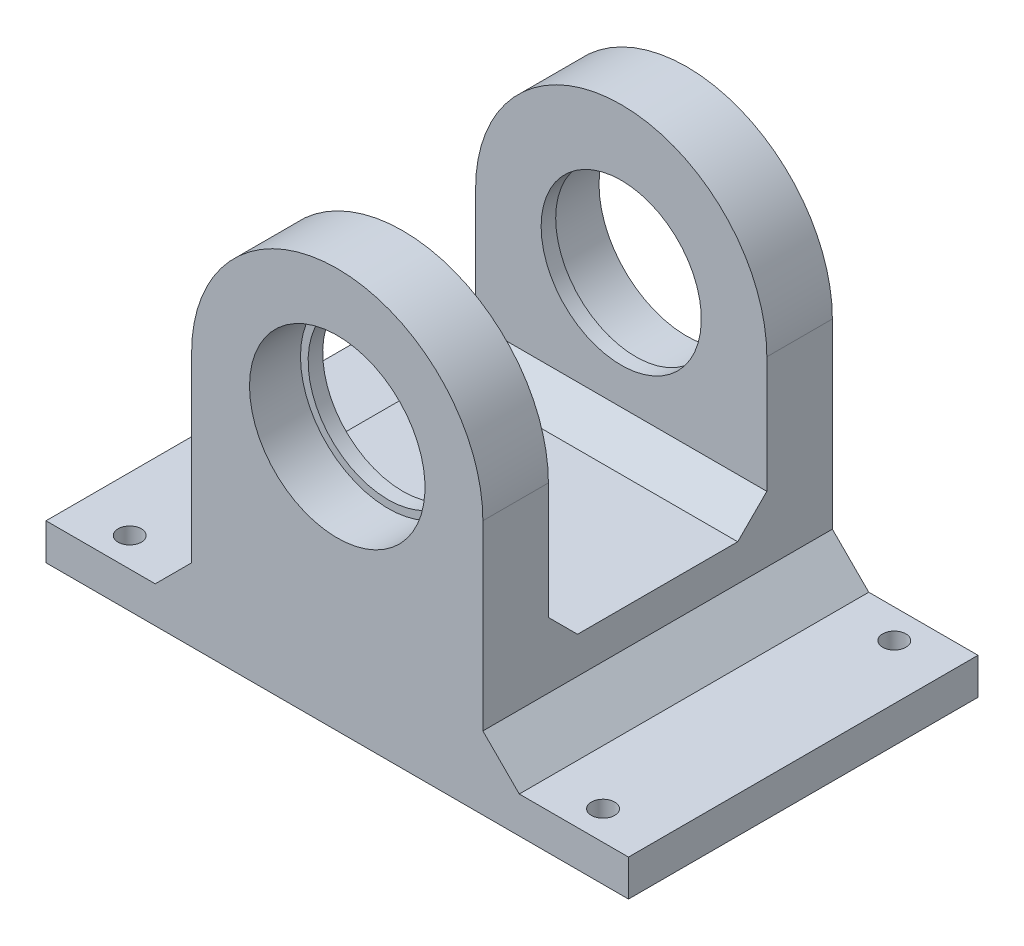
ISO-10303-21;
HEADER;
FILE_DESCRIPTION(('STEP AP214'),'2;1');
FILE_NAME('part.step','',(''),(''),'','','');
FILE_SCHEMA(('AUTOMOTIVE_DESIGN { 1 0 10303 214 1 1 1 1 }'));
ENDSEC;
DATA;
#1=APPLICATION_CONTEXT('core data for automotive mechanical design processes');
#2=APPLICATION_PROTOCOL_DEFINITION('international standard','automotive_design',2000,#1);
#3=PRODUCT_CONTEXT('',#1,'mechanical');
#4=PRODUCT('Part','Part','',(#3));
#5=PRODUCT_RELATED_PRODUCT_CATEGORY('part','',(#4));
#6=PRODUCT_DEFINITION_FORMATION('','',#4);
#7=PRODUCT_DEFINITION_CONTEXT('part definition',#1,'design');
#8=PRODUCT_DEFINITION('design','',#6,#7);
#9=PRODUCT_DEFINITION_SHAPE('','',#8);
#10=(LENGTH_UNIT() NAMED_UNIT(*) SI_UNIT(.MILLI.,.METRE.));
#11=(NAMED_UNIT(*) PLANE_ANGLE_UNIT() SI_UNIT($,.RADIAN.));
#12=(NAMED_UNIT(*) SI_UNIT($,.STERADIAN.) SOLID_ANGLE_UNIT());
#13=UNCERTAINTY_MEASURE_WITH_UNIT(LENGTH_MEASURE(1.E-05),#10,'distance_accuracy_value','');
#14=(GEOMETRIC_REPRESENTATION_CONTEXT(3) GLOBAL_UNCERTAINTY_ASSIGNED_CONTEXT((#13)) GLOBAL_UNIT_ASSIGNED_CONTEXT((#10,
#11,#12)) REPRESENTATION_CONTEXT('',''));
#15=CARTESIAN_POINT('',(0.,0.,0.));
#16=DIRECTION('',(0.,0.,1.));
#17=DIRECTION('',(1.,0.,0.));
#18=AXIS2_PLACEMENT_3D('',#15,#16,#17);
#19=CARTESIAN_POINT('',(-20.,-35.,24.));
#20=DIRECTION('',(1.,0.,0.));
#21=DIRECTION('',(0.,0.,-1.));
#22=AXIS2_PLACEMENT_3D('',#19,#20,#21);
#23=PLANE('',#22);
#24=DIRECTION('',(0.,-1.,0.));
#25=VECTOR('',#24,1.);
#26=CARTESIAN_POINT('',(-20.,-35.,-24.));
#27=LINE('',#26,#25);
#28=CARTESIAN_POINT('',(-20.,0.,-24.));
#29=VERTEX_POINT('',#28);
#30=CARTESIAN_POINT('',(-20.,-25.,-24.));
#31=VERTEX_POINT('',#30);
#32=EDGE_CURVE('E297',#29,#31,#27,.T.);
#33=ORIENTED_EDGE('',*,*,#32,.T.);
#34=DIRECTION('',(0.,0.,1.));
#35=VECTOR('',#34,1.);
#36=CARTESIAN_POINT('',(-20.,-25.,24.));
#37=LINE('',#36,#35);
#38=CARTESIAN_POINT('',(-20.,-25.,24.));
#39=VERTEX_POINT('',#38);
#40=EDGE_CURVE('E105',#31,#39,#37,.T.);
#41=ORIENTED_EDGE('',*,*,#40,.T.);
#42=DIRECTION('',(0.,-1.,0.));
#43=VECTOR('',#42,1.);
#44=CARTESIAN_POINT('',(-20.,-35.,24.));
#45=LINE('',#44,#43);
#46=CARTESIAN_POINT('',(-20.,0.,24.));
#47=VERTEX_POINT('',#46);
#48=EDGE_CURVE('E211',#47,#39,#45,.T.);
#49=ORIENTED_EDGE('',*,*,#48,.F.);
#50=DIRECTION('',(0.,0.,-1.));
#51=VECTOR('',#50,1.);
#52=CARTESIAN_POINT('',(-20.,0.,24.));
#53=LINE('',#52,#51);
#54=CARTESIAN_POINT('',(-20.,0.,15.));
#55=VERTEX_POINT('',#54);
#56=EDGE_CURVE('E300',#47,#55,#53,.T.);
#57=ORIENTED_EDGE('',*,*,#56,.T.);
#58=DIRECTION('',(0.,-1.,0.));
#59=VECTOR('',#58,1.);
#60=CARTESIAN_POINT('',(-20.,49.949963180842,15.));
#61=LINE('',#60,#59);
#62=CARTESIAN_POINT('',(-20.,-16.,15.));
#63=VERTEX_POINT('',#62);
#64=EDGE_CURVE('E273',#55,#63,#61,.T.);
#65=ORIENTED_EDGE('',*,*,#64,.T.);
#66=DIRECTION('',(0.,0.707106781186545,0.70710678118655));
#67=VECTOR('',#66,1.);
#68=CARTESIAN_POINT('',(-20.,-20.9999999999999,10.));
#69=LINE('',#68,#67);
#70=CARTESIAN_POINT('',(-20.,-20.,11.));
#71=VERTEX_POINT('',#70);
#72=EDGE_CURVE('E329',#63,#71,#69,.F.);
#73=ORIENTED_EDGE('',*,*,#72,.T.);
#74=DIRECTION('',(0.,0.,-1.));
#75=VECTOR('',#74,1.);
#76=CARTESIAN_POINT('',(-20.,-20.,15.));
#77=LINE('',#76,#75);
#78=CARTESIAN_POINT('',(-20.,-20.,-11.));
#79=VERTEX_POINT('',#78);
#80=EDGE_CURVE('E276',#71,#79,#77,.T.);
#81=ORIENTED_EDGE('',*,*,#80,.T.);
#82=DIRECTION('',(0.,-0.707106781186551,0.707106781186544));
#83=VECTOR('',#82,1.);
#84=CARTESIAN_POINT('',(-20.,-45.0000000000001,13.9999999999998));
#85=LINE('',#84,#83);
#86=CARTESIAN_POINT('',(-20.,-15.9999999999999,-15.));
#87=VERTEX_POINT('',#86);
#88=EDGE_CURVE('E325',#79,#87,#85,.F.);
#89=ORIENTED_EDGE('',*,*,#88,.T.);
#90=DIRECTION('',(0.,1.,0.));
#91=VECTOR('',#90,1.);
#92=CARTESIAN_POINT('',(-20.,49.949963180842,-15.));
#93=LINE('',#92,#91);
#94=CARTESIAN_POINT('',(-20.,0.,-15.));
#95=VERTEX_POINT('',#94);
#96=EDGE_CURVE('E271',#87,#95,#93,.T.);
#97=ORIENTED_EDGE('',*,*,#96,.T.);
#98=EDGE_CURVE('E210',#95,#29,#53,.T.);
#99=ORIENTED_EDGE('',*,*,#98,.T.);
#100=EDGE_LOOP('',(#33,#41,#49,#57,#65,#73,#81,#89,#97,#99));
#101=FACE_BOUND('',#100,.T.);
#102=ADVANCED_FACE('F82',(#101),#23,.F.);
#103=CARTESIAN_POINT('',(0.,0.,24.));
#104=DIRECTION('',(0.,0.,-1.));
#105=DIRECTION('',(-1.,0.,0.));
#106=AXIS2_PLACEMENT_3D('',#103,#104,#105);
#107=CYLINDRICAL_SURFACE('',#106,11.);
#108=CARTESIAN_POINT('',(0.,0.,15.));
#109=DIRECTION('',(0.,0.,1.));
#110=DIRECTION('',(0.,-1.,0.));
#111=AXIS2_PLACEMENT_3D('',#108,#109,#110);
#112=CIRCLE('',#111,11.);
#113=CARTESIAN_POINT('',(0.,-11.,15.));
#114=VERTEX_POINT('',#113);
#115=EDGE_CURVE('E279',#114,#114,#112,.T.);
#116=ORIENTED_EDGE('',*,*,#115,.F.);
#117=EDGE_LOOP('',(#116));
#118=FACE_BOUND('',#117,.T.);
#119=CARTESIAN_POINT('',(0.,0.,17.));
#120=DIRECTION('',(0.,0.,1.));
#121=DIRECTION('',(1.,0.,0.));
#122=AXIS2_PLACEMENT_3D('',#119,#120,#121);
#123=CIRCLE('',#122,11.);
#124=CARTESIAN_POINT('',(11.,0.,17.));
#125=VERTEX_POINT('',#124);
#126=EDGE_CURVE('E253',#125,#125,#123,.T.);
#127=ORIENTED_EDGE('',*,*,#126,.T.);
#128=EDGE_LOOP('',(#127));
#129=FACE_BOUND('',#128,.T.);
#130=ADVANCED_FACE('F401',(#118,#129),#107,.F.);
#131=CARTESIAN_POINT('',(0.,0.,-15.));
#132=DIRECTION('',(0.,0.,-1.));
#133=DIRECTION('',(0.,1.,0.));
#134=AXIS2_PLACEMENT_3D('',#131,#132,#133);
#135=CIRCLE('',#134,11.);
#136=CARTESIAN_POINT('',(0.,11.,-15.));
#137=VERTEX_POINT('',#136);
#138=EDGE_CURVE('E283',#137,#137,#135,.T.);
#139=ORIENTED_EDGE('',*,*,#138,.F.);
#140=EDGE_LOOP('',(#139));
#141=FACE_BOUND('',#140,.T.);
#142=CARTESIAN_POINT('',(0.,0.,-17.));
#143=DIRECTION('',(0.,0.,-1.));
#144=DIRECTION('',(-1.,0.,0.));
#145=AXIS2_PLACEMENT_3D('',#142,#143,#144);
#146=CIRCLE('',#145,11.);
#147=CARTESIAN_POINT('',(-11.,0.,-17.));
#148=VERTEX_POINT('',#147);
#149=EDGE_CURVE('E259',#148,#148,#146,.T.);
#150=ORIENTED_EDGE('',*,*,#149,.T.);
#151=EDGE_LOOP('',(#150));
#152=FACE_BOUND('',#151,.T.);
#153=ADVANCED_FACE('F406',(#141,#152),#107,.F.);
#154=CARTESIAN_POINT('',(0.,0.,24.));
#155=DIRECTION('',(0.,0.,-1.));
#156=DIRECTION('',(-1.,0.,0.));
#157=AXIS2_PLACEMENT_3D('',#154,#155,#156);
#158=CYLINDRICAL_SURFACE('',#157,20.);
#159=ORIENTED_EDGE('',*,*,#98,.F.);
#160=CARTESIAN_POINT('',(0.,0.,-15.));
#161=DIRECTION('',(0.,0.,-1.));
#162=DIRECTION('',(0.,1.,0.));
#163=AXIS2_PLACEMENT_3D('',#160,#161,#162);
#164=CIRCLE('',#163,20.);
#165=CARTESIAN_POINT('',(20.,0.,-15.));
#166=VERTEX_POINT('',#165);
#167=EDGE_CURVE('E284',#95,#166,#164,.T.);
#168=ORIENTED_EDGE('',*,*,#167,.T.);
#169=DIRECTION('',(0.,0.,-1.));
#170=VECTOR('',#169,1.);
#171=CARTESIAN_POINT('',(20.,0.,24.));
#172=LINE('',#171,#170);
#173=CARTESIAN_POINT('',(20.,0.,-24.));
#174=VERTEX_POINT('',#173);
#175=EDGE_CURVE('E303',#166,#174,#172,.T.);
#176=ORIENTED_EDGE('',*,*,#175,.T.);
#177=CARTESIAN_POINT('',(0.,0.,-24.));
#178=DIRECTION('',(0.,0.,1.));
#179=DIRECTION('',(1.,0.,0.));
#180=AXIS2_PLACEMENT_3D('',#177,#178,#179);
#181=CIRCLE('',#180,20.);
#182=EDGE_CURVE('E294',#174,#29,#181,.T.);
#183=ORIENTED_EDGE('',*,*,#182,.T.);
#184=EDGE_LOOP('',(#159,#168,#176,#183));
#185=FACE_BOUND('',#184,.T.);
#186=ADVANCED_FACE('F415',(#185),#158,.T.);
#187=CARTESIAN_POINT('',(0.,0.,24.));
#188=DIRECTION('',(0.,0.,1.));
#189=DIRECTION('',(1.,0.,0.));
#190=AXIS2_PLACEMENT_3D('',#187,#188,#189);
#191=PLANE('',#190);
#192=CARTESIAN_POINT('',(0.,0.,24.));
#193=DIRECTION('',(0.,0.,-1.));
#194=DIRECTION('',(-1.,0.,0.));
#195=AXIS2_PLACEMENT_3D('',#192,#193,#194);
#196=CIRCLE('',#195,12.05);
#197=CARTESIAN_POINT('',(-12.05,0.,24.));
#198=VERTEX_POINT('',#197);
#199=EDGE_CURVE('E249',#198,#198,#196,.T.);
#200=ORIENTED_EDGE('',*,*,#199,.T.);
#201=EDGE_LOOP('',(#200));
#202=FACE_BOUND('',#201,.T.);
#203=DIRECTION('',(1.,0.,0.));
#204=VECTOR('',#203,1.);
#205=CARTESIAN_POINT('',(-20.,-35.,24.));
#206=LINE('',#205,#204);
#207=CARTESIAN_POINT('',(-40.,-35.,24.));
#208=VERTEX_POINT('',#207);
#209=CARTESIAN_POINT('',(40.,-35.,24.));
#210=VERTEX_POINT('',#209);
#211=EDGE_CURVE('E197',#208,#210,#206,.T.);
#212=ORIENTED_EDGE('',*,*,#211,.T.);
#213=DIRECTION('',(0.,1.,0.));
#214=VECTOR('',#213,1.);
#215=CARTESIAN_POINT('',(40.,-35.,24.));
#216=LINE('',#215,#214);
#217=CARTESIAN_POINT('',(40.,-30.,24.));
#218=VERTEX_POINT('',#217);
#219=EDGE_CURVE('E201',#210,#218,#216,.T.);
#220=ORIENTED_EDGE('',*,*,#219,.T.);
#221=DIRECTION('',(-1.,0.,0.));
#222=VECTOR('',#221,1.);
#223=CARTESIAN_POINT('',(40.,-30.,24.));
#224=LINE('',#223,#222);
#225=CARTESIAN_POINT('',(25.,-30.,24.));
#226=VERTEX_POINT('',#225);
#227=EDGE_CURVE('E231',#218,#226,#224,.T.);
#228=ORIENTED_EDGE('',*,*,#227,.T.);
#229=DIRECTION('',(-0.707106781186548,0.707106781186548,0.));
#230=VECTOR('',#229,1.);
#231=CARTESIAN_POINT('',(20.,-25.,24.));
#232=LINE('',#231,#230);
#233=CARTESIAN_POINT('',(20.,-25.,24.));
#234=VERTEX_POINT('',#233);
#235=EDGE_CURVE('E344',#226,#234,#232,.T.);
#236=ORIENTED_EDGE('',*,*,#235,.T.);
#237=DIRECTION('',(0.,1.,0.));
#238=VECTOR('',#237,1.);
#239=CARTESIAN_POINT('',(20.,-35.,24.));
#240=LINE('',#239,#238);
#241=CARTESIAN_POINT('',(20.,0.,24.));
#242=VERTEX_POINT('',#241);
#243=EDGE_CURVE('E288',#234,#242,#240,.T.);
#244=ORIENTED_EDGE('',*,*,#243,.T.);
#245=CARTESIAN_POINT('',(0.,0.,24.));
#246=DIRECTION('',(0.,0.,1.));
#247=DIRECTION('',(1.,0.,0.));
#248=AXIS2_PLACEMENT_3D('',#245,#246,#247);
#249=CIRCLE('',#248,20.);
#250=EDGE_CURVE('E290',#242,#47,#249,.T.);
#251=ORIENTED_EDGE('',*,*,#250,.T.);
#252=ORIENTED_EDGE('',*,*,#48,.T.);
#253=DIRECTION('',(0.707106781186548,0.707106781186548,0.));
#254=VECTOR('',#253,1.);
#255=CARTESIAN_POINT('',(-25.,-30.,24.));
#256=LINE('',#255,#254);
#257=CARTESIAN_POINT('',(-25.,-30.,24.));
#258=VERTEX_POINT('',#257);
#259=EDGE_CURVE('E12',#39,#258,#256,.F.);
#260=ORIENTED_EDGE('',*,*,#259,.T.);
#261=DIRECTION('',(1.,0.,0.));
#262=VECTOR('',#261,1.);
#263=CARTESIAN_POINT('',(-40.,-30.,24.));
#264=LINE('',#263,#262);
#265=CARTESIAN_POINT('',(-40.,-30.,24.));
#266=VERTEX_POINT('',#265);
#267=EDGE_CURVE('E246',#266,#258,#264,.T.);
#268=ORIENTED_EDGE('',*,*,#267,.F.);
#269=DIRECTION('',(0.,1.,0.));
#270=VECTOR('',#269,1.);
#271=CARTESIAN_POINT('',(-40.,-35.,24.));
#272=LINE('',#271,#270);
#273=EDGE_CURVE('E205',#208,#266,#272,.T.);
#274=ORIENTED_EDGE('',*,*,#273,.F.);
#275=EDGE_LOOP('',(#212,#220,#228,#236,#244,#251,#252,#260,#268,#274));
#276=FACE_BOUND('',#275,.T.);
#277=ADVANCED_FACE('F199',(#202,#276),#191,.T.);
#278=CARTESIAN_POINT('',(0.,0.,-24.));
#279=DIRECTION('',(0.,0.,1.));
#280=DIRECTION('',(1.,0.,0.));
#281=AXIS2_PLACEMENT_3D('',#278,#279,#280);
#282=PLANE('',#281);
#283=CARTESIAN_POINT('',(0.,0.,-24.));
#284=DIRECTION('',(0.,0.,-1.));
#285=DIRECTION('',(-1.,0.,0.));
#286=AXIS2_PLACEMENT_3D('',#283,#284,#285);
#287=CIRCLE('',#286,12.05);
#288=CARTESIAN_POINT('',(-12.05,0.,-24.));
#289=VERTEX_POINT('',#288);
#290=EDGE_CURVE('E260',#289,#289,#287,.T.);
#291=ORIENTED_EDGE('',*,*,#290,.F.);
#292=EDGE_LOOP('',(#291));
#293=FACE_BOUND('',#292,.T.);
#294=DIRECTION('',(0.,1.,0.));
#295=VECTOR('',#294,1.);
#296=CARTESIAN_POINT('',(20.,-35.,-24.));
#297=LINE('',#296,#295);
#298=CARTESIAN_POINT('',(20.,-25.,-24.));
#299=VERTEX_POINT('',#298);
#300=EDGE_CURVE('E287',#299,#174,#297,.T.);
#301=ORIENTED_EDGE('',*,*,#300,.F.);
#302=DIRECTION('',(0.707106781186548,-0.707106781186548,0.));
#303=VECTOR('',#302,1.);
#304=CARTESIAN_POINT('',(-2.50000000000001,-2.50000000000001,-24.));
#305=LINE('',#304,#303);
#306=CARTESIAN_POINT('',(25.,-30.,-24.));
#307=VERTEX_POINT('',#306);
#308=EDGE_CURVE('E342',#299,#307,#305,.T.);
#309=ORIENTED_EDGE('',*,*,#308,.T.);
#310=DIRECTION('',(-1.,0.,0.));
#311=VECTOR('',#310,1.);
#312=CARTESIAN_POINT('',(40.,-30.,-24.));
#313=LINE('',#312,#311);
#314=CARTESIAN_POINT('',(40.,-30.,-24.));
#315=VERTEX_POINT('',#314);
#316=EDGE_CURVE('E233',#315,#307,#313,.T.);
#317=ORIENTED_EDGE('',*,*,#316,.F.);
#318=DIRECTION('',(0.,-1.,0.));
#319=VECTOR('',#318,1.);
#320=CARTESIAN_POINT('',(40.,-35.,-24.));
#321=LINE('',#320,#319);
#322=CARTESIAN_POINT('',(40.,-35.,-24.));
#323=VERTEX_POINT('',#322);
#324=EDGE_CURVE('E225',#315,#323,#321,.T.);
#325=ORIENTED_EDGE('',*,*,#324,.T.);
#326=DIRECTION('',(1.,0.,0.));
#327=VECTOR('',#326,1.);
#328=CARTESIAN_POINT('',(-20.,-35.,-24.));
#329=LINE('',#328,#327);
#330=CARTESIAN_POINT('',(-40.,-35.,-24.));
#331=VERTEX_POINT('',#330);
#332=EDGE_CURVE('E224',#331,#323,#329,.T.);
#333=ORIENTED_EDGE('',*,*,#332,.F.);
#334=DIRECTION('',(0.,-1.,0.));
#335=VECTOR('',#334,1.);
#336=CARTESIAN_POINT('',(-40.,-35.,-24.));
#337=LINE('',#336,#335);
#338=CARTESIAN_POINT('',(-40.,-30.,-24.));
#339=VERTEX_POINT('',#338);
#340=EDGE_CURVE('E239',#339,#331,#337,.T.);
#341=ORIENTED_EDGE('',*,*,#340,.F.);
#342=DIRECTION('',(1.,0.,0.));
#343=VECTOR('',#342,1.);
#344=CARTESIAN_POINT('',(-40.,-30.,-24.));
#345=LINE('',#344,#343);
#346=CARTESIAN_POINT('',(-25.,-30.,-24.));
#347=VERTEX_POINT('',#346);
#348=EDGE_CURVE('E244',#339,#347,#345,.T.);
#349=ORIENTED_EDGE('',*,*,#348,.T.);
#350=DIRECTION('',(-0.707106781186548,-0.707106781186548,0.));
#351=VECTOR('',#350,1.);
#352=CARTESIAN_POINT('',(2.50000000000001,-2.50000000000001,-24.));
#353=LINE('',#352,#351);
#354=EDGE_CURVE('E91',#347,#31,#353,.F.);
#355=ORIENTED_EDGE('',*,*,#354,.T.);
#356=ORIENTED_EDGE('',*,*,#32,.F.);
#357=ORIENTED_EDGE('',*,*,#182,.F.);
#358=EDGE_LOOP('',(#301,#309,#317,#325,#333,#341,#349,#355,#356,#357));
#359=FACE_BOUND('',#358,.T.);
#360=ADVANCED_FACE('F418',(#293,#359),#282,.F.);
#361=CARTESIAN_POINT('',(20.,-35.,24.));
#362=DIRECTION('',(-1.,0.,0.));
#363=DIRECTION('',(0.,0.,1.));
#364=AXIS2_PLACEMENT_3D('',#361,#362,#363);
#365=PLANE('',#364);
#366=ORIENTED_EDGE('',*,*,#243,.F.);
#367=DIRECTION('',(0.,0.,-1.));
#368=VECTOR('',#367,1.);
#369=CARTESIAN_POINT('',(20.,-25.,24.));
#370=LINE('',#369,#368);
#371=EDGE_CURVE('E331',#234,#299,#370,.T.);
#372=ORIENTED_EDGE('',*,*,#371,.T.);
#373=ORIENTED_EDGE('',*,*,#300,.T.);
#374=ORIENTED_EDGE('',*,*,#175,.F.);
#375=DIRECTION('',(0.,1.,0.));
#376=VECTOR('',#375,1.);
#377=CARTESIAN_POINT('',(20.,49.949963180842,-15.));
#378=LINE('',#377,#376);
#379=CARTESIAN_POINT('',(20.,-15.9999999999999,-15.));
#380=VERTEX_POINT('',#379);
#381=EDGE_CURVE('E263',#380,#166,#378,.T.);
#382=ORIENTED_EDGE('',*,*,#381,.F.);
#383=DIRECTION('',(0.,0.707106781186551,-0.707106781186544));
#384=VECTOR('',#383,1.);
#385=CARTESIAN_POINT('',(20.,-45.0000000000001,13.9999999999998));
#386=LINE('',#385,#384);
#387=CARTESIAN_POINT('',(20.,-20.,-11.));
#388=VERTEX_POINT('',#387);
#389=EDGE_CURVE('E323',#380,#388,#386,.F.);
#390=ORIENTED_EDGE('',*,*,#389,.T.);
#391=DIRECTION('',(0.,0.,-1.));
#392=VECTOR('',#391,1.);
#393=CARTESIAN_POINT('',(20.,-20.,15.));
#394=LINE('',#393,#392);
#395=CARTESIAN_POINT('',(20.,-20.,11.));
#396=VERTEX_POINT('',#395);
#397=EDGE_CURVE('E268',#396,#388,#394,.T.);
#398=ORIENTED_EDGE('',*,*,#397,.F.);
#399=DIRECTION('',(0.,-0.707106781186545,-0.70710678118655));
#400=VECTOR('',#399,1.);
#401=CARTESIAN_POINT('',(20.,-20.9999999999999,10.));
#402=LINE('',#401,#400);
#403=CARTESIAN_POINT('',(20.,-16.,15.));
#404=VERTEX_POINT('',#403);
#405=EDGE_CURVE('E327',#396,#404,#402,.F.);
#406=ORIENTED_EDGE('',*,*,#405,.T.);
#407=DIRECTION('',(0.,-1.,0.));
#408=VECTOR('',#407,1.);
#409=CARTESIAN_POINT('',(20.,49.949963180842,15.));
#410=LINE('',#409,#408);
#411=CARTESIAN_POINT('',(20.,0.,15.));
#412=VERTEX_POINT('',#411);
#413=EDGE_CURVE('E265',#412,#404,#410,.T.);
#414=ORIENTED_EDGE('',*,*,#413,.F.);
#415=EDGE_CURVE('E304',#242,#412,#172,.T.);
#416=ORIENTED_EDGE('',*,*,#415,.F.);
#417=EDGE_LOOP('',(#366,#372,#373,#374,#382,#390,#398,#406,#414,#416));
#418=FACE_BOUND('',#417,.T.);
#419=ADVANCED_FACE('F413',(#418),#365,.F.);
#420=ORIENTED_EDGE('',*,*,#415,.T.);
#421=CARTESIAN_POINT('',(0.,0.,15.));
#422=DIRECTION('',(0.,0.,1.));
#423=DIRECTION('',(0.,-1.,0.));
#424=AXIS2_PLACEMENT_3D('',#421,#422,#423);
#425=CIRCLE('',#424,20.);
#426=EDGE_CURVE('E280',#412,#55,#425,.T.);
#427=ORIENTED_EDGE('',*,*,#426,.T.);
#428=ORIENTED_EDGE('',*,*,#56,.F.);
#429=ORIENTED_EDGE('',*,*,#250,.F.);
#430=EDGE_LOOP('',(#420,#427,#428,#429));
#431=FACE_BOUND('',#430,.T.);
#432=ADVANCED_FACE('F379',(#431),#158,.T.);
#433=CARTESIAN_POINT('',(-20.,-35.,24.));
#434=DIRECTION('',(0.,1.,0.));
#435=DIRECTION('',(0.,0.,1.));
#436=AXIS2_PLACEMENT_3D('',#433,#434,#435);
#437=PLANE('',#436);
#438=CARTESIAN_POINT('',(-32.5,-35.,-20.));
#439=DIRECTION('',(0.,-1.,0.));
#440=DIRECTION('',(0.,0.,1.));
#441=AXIS2_PLACEMENT_3D('',#438,#439,#440);
#442=CIRCLE('',#441,1.6);
#443=CARTESIAN_POINT('',(-32.5,-35.,-18.4));
#444=VERTEX_POINT('',#443);
#445=EDGE_CURVE('E353',#444,#444,#442,.T.);
#446=ORIENTED_EDGE('',*,*,#445,.F.);
#447=EDGE_LOOP('',(#446));
#448=FACE_BOUND('',#447,.T.);
#449=CARTESIAN_POINT('',(-32.5,-35.,20.));
#450=DIRECTION('',(0.,-1.,0.));
#451=DIRECTION('',(0.,0.,-1.));
#452=AXIS2_PLACEMENT_3D('',#449,#450,#451);
#453=CIRCLE('',#452,1.6);
#454=CARTESIAN_POINT('',(-32.5,-35.,18.4));
#455=VERTEX_POINT('',#454);
#456=EDGE_CURVE('E367',#455,#455,#453,.T.);
#457=ORIENTED_EDGE('',*,*,#456,.F.);
#458=EDGE_LOOP('',(#457));
#459=FACE_BOUND('',#458,.T.);
#460=CARTESIAN_POINT('',(32.5,-35.,20.));
#461=DIRECTION('',(0.,-1.,0.));
#462=DIRECTION('',(0.,0.,1.));
#463=AXIS2_PLACEMENT_3D('',#460,#461,#462);
#464=CIRCLE('',#463,1.6);
#465=CARTESIAN_POINT('',(32.5,-35.,21.6));
#466=VERTEX_POINT('',#465);
#467=EDGE_CURVE('E364',#466,#466,#464,.T.);
#468=ORIENTED_EDGE('',*,*,#467,.F.);
#469=EDGE_LOOP('',(#468));
#470=FACE_BOUND('',#469,.T.);
#471=CARTESIAN_POINT('',(32.5,-35.,-20.));
#472=DIRECTION('',(0.,-1.,0.));
#473=DIRECTION('',(0.,0.,-1.));
#474=AXIS2_PLACEMENT_3D('',#471,#472,#473);
#475=CIRCLE('',#474,1.6);
#476=CARTESIAN_POINT('',(32.5,-35.,-21.6));
#477=VERTEX_POINT('',#476);
#478=EDGE_CURVE('E349',#477,#477,#475,.T.);
#479=ORIENTED_EDGE('',*,*,#478,.F.);
#480=EDGE_LOOP('',(#479));
#481=FACE_BOUND('',#480,.T.);
#482=ORIENTED_EDGE('',*,*,#332,.T.);
#483=DIRECTION('',(0.,0.,1.));
#484=VECTOR('',#483,1.);
#485=CARTESIAN_POINT('',(40.,-35.,-24.));
#486=LINE('',#485,#484);
#487=EDGE_CURVE('E217',#323,#210,#486,.T.);
#488=ORIENTED_EDGE('',*,*,#487,.T.);
#489=ORIENTED_EDGE('',*,*,#211,.F.);
#490=DIRECTION('',(0.,0.,1.));
#491=VECTOR('',#490,1.);
#492=CARTESIAN_POINT('',(-40.,-35.,-24.));
#493=LINE('',#492,#491);
#494=EDGE_CURVE('E242',#331,#208,#493,.T.);
#495=ORIENTED_EDGE('',*,*,#494,.F.);
#496=EDGE_LOOP('',(#482,#488,#489,#495));
#497=FACE_BOUND('',#496,.T.);
#498=ADVANCED_FACE('F223',(#448,#459,#470,#481,#497),#437,.F.);
#499=CARTESIAN_POINT('',(-20.,49.949963180842,-15.));
#500=DIRECTION('',(0.,0.,-1.));
#501=DIRECTION('',(0.,1.,0.));
#502=AXIS2_PLACEMENT_3D('',#499,#500,#501);
#503=PLANE('',#502);
#504=ORIENTED_EDGE('',*,*,#138,.T.);
#505=EDGE_LOOP('',(#504));
#506=FACE_BOUND('',#505,.T.);
#507=ORIENTED_EDGE('',*,*,#96,.F.);
#508=DIRECTION('',(1.,0.,0.));
#509=VECTOR('',#508,1.);
#510=CARTESIAN_POINT('',(20.,-16.,-15.));
#511=LINE('',#510,#509);
#512=EDGE_CURVE('E307',#87,#380,#511,.T.);
#513=ORIENTED_EDGE('',*,*,#512,.T.);
#514=ORIENTED_EDGE('',*,*,#381,.T.);
#515=ORIENTED_EDGE('',*,*,#167,.F.);
#516=EDGE_LOOP('',(#507,#513,#514,#515));
#517=FACE_BOUND('',#516,.T.);
#518=ADVANCED_FACE('F378',(#506,#517),#503,.F.);
#519=CARTESIAN_POINT('',(-20.,49.949963180842,15.));
#520=DIRECTION('',(0.,0.,1.));
#521=DIRECTION('',(0.,-1.,0.));
#522=AXIS2_PLACEMENT_3D('',#519,#520,#521);
#523=PLANE('',#522);
#524=ORIENTED_EDGE('',*,*,#115,.T.);
#525=EDGE_LOOP('',(#524));
#526=FACE_BOUND('',#525,.T.);
#527=ORIENTED_EDGE('',*,*,#413,.T.);
#528=DIRECTION('',(-1.,0.,0.));
#529=VECTOR('',#528,1.);
#530=CARTESIAN_POINT('',(-20.,-16.,15.));
#531=LINE('',#530,#529);
#532=EDGE_CURVE('E321',#404,#63,#531,.T.);
#533=ORIENTED_EDGE('',*,*,#532,.T.);
#534=ORIENTED_EDGE('',*,*,#64,.F.);
#535=ORIENTED_EDGE('',*,*,#426,.F.);
#536=EDGE_LOOP('',(#527,#533,#534,#535));
#537=FACE_BOUND('',#536,.T.);
#538=ADVANCED_FACE('F483',(#526,#537),#523,.F.);
#539=CARTESIAN_POINT('',(-20.,-20.,15.));
#540=DIRECTION('',(0.,-1.,0.));
#541=DIRECTION('',(0.,0.,-1.));
#542=AXIS2_PLACEMENT_3D('',#539,#540,#541);
#543=PLANE('',#542);
#544=ORIENTED_EDGE('',*,*,#397,.T.);
#545=DIRECTION('',(-1.,0.,0.));
#546=VECTOR('',#545,1.);
#547=CARTESIAN_POINT('',(-20.,-20.,-11.));
#548=LINE('',#547,#546);
#549=EDGE_CURVE('E319',#388,#79,#548,.T.);
#550=ORIENTED_EDGE('',*,*,#549,.T.);
#551=ORIENTED_EDGE('',*,*,#80,.F.);
#552=DIRECTION('',(1.,0.,0.));
#553=VECTOR('',#552,1.);
#554=CARTESIAN_POINT('',(20.,-20.,11.));
#555=LINE('',#554,#553);
#556=EDGE_CURVE('E316',#71,#396,#555,.T.);
#557=ORIENTED_EDGE('',*,*,#556,.T.);
#558=EDGE_LOOP('',(#544,#550,#551,#557));
#559=FACE_BOUND('',#558,.T.);
#560=ADVANCED_FACE('F479',(#559),#543,.F.);
#561=CARTESIAN_POINT('',(0.,0.,-17.));
#562=DIRECTION('',(0.,0.,-1.));
#563=DIRECTION('',(-1.,0.,0.));
#564=AXIS2_PLACEMENT_3D('',#561,#562,#563);
#565=CYLINDRICAL_SURFACE('',#564,12.05);
#566=CARTESIAN_POINT('',(0.,0.,-17.));
#567=DIRECTION('',(0.,0.,-1.));
#568=DIRECTION('',(-1.,0.,0.));
#569=AXIS2_PLACEMENT_3D('',#566,#567,#568);
#570=CIRCLE('',#569,12.05);
#571=CARTESIAN_POINT('',(-12.05,0.,-17.));
#572=VERTEX_POINT('',#571);
#573=EDGE_CURVE('E256',#572,#572,#570,.T.);
#574=ORIENTED_EDGE('',*,*,#573,.F.);
#575=EDGE_LOOP('',(#574));
#576=FACE_BOUND('',#575,.T.);
#577=ORIENTED_EDGE('',*,*,#290,.T.);
#578=EDGE_LOOP('',(#577));
#579=FACE_BOUND('',#578,.T.);
#580=ADVANCED_FACE('F475',(#576,#579),#565,.F.);
#581=CARTESIAN_POINT('',(0.,0.,-17.));
#582=DIRECTION('',(0.,0.,-1.));
#583=DIRECTION('',(-1.,0.,0.));
#584=AXIS2_PLACEMENT_3D('',#581,#582,#583);
#585=PLANE('',#584);
#586=ORIENTED_EDGE('',*,*,#149,.F.);
#587=EDGE_LOOP('',(#586));
#588=FACE_BOUND('',#587,.T.);
#589=ORIENTED_EDGE('',*,*,#573,.T.);
#590=EDGE_LOOP('',(#589));
#591=FACE_BOUND('',#590,.T.);
#592=ADVANCED_FACE('F424',(#588,#591),#585,.T.);
#593=CARTESIAN_POINT('',(-20.,-16.,-15.));
#594=DIRECTION('',(0.,0.707106781186544,0.707106781186551));
#595=DIRECTION('',(-1.,0.,0.));
#596=AXIS2_PLACEMENT_3D('',#593,#594,#595);
#597=PLANE('',#596);
#598=ORIENTED_EDGE('',*,*,#88,.F.);
#599=ORIENTED_EDGE('',*,*,#549,.F.);
#600=ORIENTED_EDGE('',*,*,#389,.F.);
#601=ORIENTED_EDGE('',*,*,#512,.F.);
#602=EDGE_LOOP('',(#598,#599,#600,#601));
#603=FACE_BOUND('',#602,.T.);
#604=ADVANCED_FACE('F420',(#603),#597,.T.);
#605=CARTESIAN_POINT('',(-20.,-20.,11.));
#606=DIRECTION('',(0.,0.70710678118655,-0.707106781186545));
#607=DIRECTION('',(-1.,0.,0.));
#608=AXIS2_PLACEMENT_3D('',#605,#606,#607);
#609=PLANE('',#608);
#610=ORIENTED_EDGE('',*,*,#72,.F.);
#611=ORIENTED_EDGE('',*,*,#532,.F.);
#612=ORIENTED_EDGE('',*,*,#405,.F.);
#613=ORIENTED_EDGE('',*,*,#556,.F.);
#614=EDGE_LOOP('',(#610,#611,#612,#613));
#615=FACE_BOUND('',#614,.T.);
#616=ADVANCED_FACE('F423',(#615),#609,.T.);
#617=CARTESIAN_POINT('',(0.,0.,17.));
#618=DIRECTION('',(0.,0.,1.));
#619=DIRECTION('',(1.,0.,0.));
#620=AXIS2_PLACEMENT_3D('',#617,#618,#619);
#621=CYLINDRICAL_SURFACE('',#620,12.05);
#622=CARTESIAN_POINT('',(0.,0.,17.));
#623=DIRECTION('',(0.,0.,-1.));
#624=DIRECTION('',(-1.,0.,0.));
#625=AXIS2_PLACEMENT_3D('',#622,#623,#624);
#626=CIRCLE('',#625,12.05);
#627=CARTESIAN_POINT('',(-12.05,0.,17.));
#628=VERTEX_POINT('',#627);
#629=EDGE_CURVE('E250',#628,#628,#626,.T.);
#630=ORIENTED_EDGE('',*,*,#629,.T.);
#631=EDGE_LOOP('',(#630));
#632=FACE_BOUND('',#631,.T.);
#633=ORIENTED_EDGE('',*,*,#199,.F.);
#634=EDGE_LOOP('',(#633));
#635=FACE_BOUND('',#634,.T.);
#636=ADVANCED_FACE('F427',(#632,#635),#621,.F.);
#637=CARTESIAN_POINT('',(0.,0.,17.));
#638=DIRECTION('',(0.,0.,1.));
#639=DIRECTION('',(-1.,0.,0.));
#640=AXIS2_PLACEMENT_3D('',#637,#638,#639);
#641=PLANE('',#640);
#642=ORIENTED_EDGE('',*,*,#126,.F.);
#643=EDGE_LOOP('',(#642));
#644=FACE_BOUND('',#643,.T.);
#645=ORIENTED_EDGE('',*,*,#629,.F.);
#646=EDGE_LOOP('',(#645));
#647=FACE_BOUND('',#646,.T.);
#648=ADVANCED_FACE('F464',(#644,#647),#641,.T.);
#649=CARTESIAN_POINT('',(-40.,-30.,-24.));
#650=DIRECTION('',(0.,-1.,0.));
#651=DIRECTION('',(0.,0.,-1.));
#652=AXIS2_PLACEMENT_3D('',#649,#650,#651);
#653=PLANE('',#652);
#654=CARTESIAN_POINT('',(-32.5,-30.,-20.));
#655=DIRECTION('',(0.,-1.,0.));
#656=DIRECTION('',(0.,0.,-1.));
#657=AXIS2_PLACEMENT_3D('',#654,#655,#656);
#658=CIRCLE('',#657,1.6);
#659=CARTESIAN_POINT('',(-32.5,-30.,-21.6));
#660=VERTEX_POINT('',#659);
#661=EDGE_CURVE('E86',#660,#660,#658,.T.);
#662=ORIENTED_EDGE('',*,*,#661,.T.);
#663=EDGE_LOOP('',(#662));
#664=FACE_BOUND('',#663,.T.);
#665=CARTESIAN_POINT('',(-32.5,-30.,20.));
#666=DIRECTION('',(0.,-1.,0.));
#667=DIRECTION('',(0.,0.,-1.));
#668=AXIS2_PLACEMENT_3D('',#665,#666,#667);
#669=CIRCLE('',#668,1.6);
#670=CARTESIAN_POINT('',(-32.5,-30.,18.4));
#671=VERTEX_POINT('',#670);
#672=EDGE_CURVE('E352',#671,#671,#669,.T.);
#673=ORIENTED_EDGE('',*,*,#672,.T.);
#674=EDGE_LOOP('',(#673));
#675=FACE_BOUND('',#674,.T.);
#676=ORIENTED_EDGE('',*,*,#267,.T.);
#677=DIRECTION('',(0.,0.,-1.));
#678=VECTOR('',#677,1.);
#679=CARTESIAN_POINT('',(-25.,-30.,-24.));
#680=LINE('',#679,#678);
#681=EDGE_CURVE('E338',#258,#347,#680,.T.);
#682=ORIENTED_EDGE('',*,*,#681,.T.);
#683=ORIENTED_EDGE('',*,*,#348,.F.);
#684=DIRECTION('',(0.,0.,-1.));
#685=VECTOR('',#684,1.);
#686=CARTESIAN_POINT('',(-40.,-30.,-24.));
#687=LINE('',#686,#685);
#688=EDGE_CURVE('E237',#266,#339,#687,.T.);
#689=ORIENTED_EDGE('',*,*,#688,.F.);
#690=EDGE_LOOP('',(#676,#682,#683,#689));
#691=FACE_BOUND('',#690,.T.);
#692=ADVANCED_FACE('F452',(#664,#675,#691),#653,.F.);
#693=CARTESIAN_POINT('',(-40.,0.,0.));
#694=DIRECTION('',(1.,0.,0.));
#695=DIRECTION('',(0.,0.,-1.));
#696=AXIS2_PLACEMENT_3D('',#693,#694,#695);
#697=PLANE('',#696);
#698=ORIENTED_EDGE('',*,*,#273,.T.);
#699=ORIENTED_EDGE('',*,*,#688,.T.);
#700=ORIENTED_EDGE('',*,*,#340,.T.);
#701=ORIENTED_EDGE('',*,*,#494,.T.);
#702=EDGE_LOOP('',(#698,#699,#700,#701));
#703=FACE_BOUND('',#702,.T.);
#704=ADVANCED_FACE('F455',(#703),#697,.F.);
#705=CARTESIAN_POINT('',(40.,-30.,-24.));
#706=DIRECTION('',(0.,1.,0.));
#707=DIRECTION('',(0.,0.,1.));
#708=AXIS2_PLACEMENT_3D('',#705,#706,#707);
#709=PLANE('',#708);
#710=CARTESIAN_POINT('',(32.5,-30.,20.));
#711=DIRECTION('',(0.,1.,0.));
#712=DIRECTION('',(0.,0.,1.));
#713=AXIS2_PLACEMENT_3D('',#710,#711,#712);
#714=CIRCLE('',#713,1.6);
#715=CARTESIAN_POINT('',(32.5,-30.,21.6));
#716=VERTEX_POINT('',#715);
#717=EDGE_CURVE('E350',#716,#716,#714,.T.);
#718=ORIENTED_EDGE('',*,*,#717,.F.);
#719=EDGE_LOOP('',(#718));
#720=FACE_BOUND('',#719,.T.);
#721=CARTESIAN_POINT('',(32.5,-30.,-20.));
#722=DIRECTION('',(0.,1.,0.));
#723=DIRECTION('',(0.,0.,1.));
#724=AXIS2_PLACEMENT_3D('',#721,#722,#723);
#725=CIRCLE('',#724,1.6);
#726=CARTESIAN_POINT('',(32.5,-30.,-18.4));
#727=VERTEX_POINT('',#726);
#728=EDGE_CURVE('E221',#727,#727,#725,.T.);
#729=ORIENTED_EDGE('',*,*,#728,.F.);
#730=EDGE_LOOP('',(#729));
#731=FACE_BOUND('',#730,.T.);
#732=ORIENTED_EDGE('',*,*,#316,.T.);
#733=DIRECTION('',(0.,0.,1.));
#734=VECTOR('',#733,1.);
#735=CARTESIAN_POINT('',(25.,-30.,-24.));
#736=LINE('',#735,#734);
#737=EDGE_CURVE('E336',#307,#226,#736,.T.);
#738=ORIENTED_EDGE('',*,*,#737,.T.);
#739=ORIENTED_EDGE('',*,*,#227,.F.);
#740=DIRECTION('',(0.,0.,-1.));
#741=VECTOR('',#740,1.);
#742=CARTESIAN_POINT('',(40.,-30.,-24.));
#743=LINE('',#742,#741);
#744=EDGE_CURVE('E220',#218,#315,#743,.T.);
#745=ORIENTED_EDGE('',*,*,#744,.T.);
#746=EDGE_LOOP('',(#732,#738,#739,#745));
#747=FACE_BOUND('',#746,.T.);
#748=ADVANCED_FACE('F437',(#720,#731,#747),#709,.T.);
#749=CARTESIAN_POINT('',(40.,0.,0.));
#750=DIRECTION('',(-1.,0.,0.));
#751=DIRECTION('',(0.,0.,-1.));
#752=AXIS2_PLACEMENT_3D('',#749,#750,#751);
#753=PLANE('',#752);
#754=ORIENTED_EDGE('',*,*,#219,.F.);
#755=ORIENTED_EDGE('',*,*,#487,.F.);
#756=ORIENTED_EDGE('',*,*,#324,.F.);
#757=ORIENTED_EDGE('',*,*,#744,.F.);
#758=EDGE_LOOP('',(#754,#755,#756,#757));
#759=FACE_BOUND('',#758,.T.);
#760=ADVANCED_FACE('F215',(#759),#753,.F.);
#761=CARTESIAN_POINT('',(20.,-25.,24.));
#762=DIRECTION('',(-0.707106781186547,-0.707106781186547,0.));
#763=DIRECTION('',(0.,0.,-1.));
#764=AXIS2_PLACEMENT_3D('',#761,#762,#763);
#765=PLANE('',#764);
#766=ORIENTED_EDGE('',*,*,#235,.F.);
#767=ORIENTED_EDGE('',*,*,#737,.F.);
#768=ORIENTED_EDGE('',*,*,#308,.F.);
#769=ORIENTED_EDGE('',*,*,#371,.F.);
#770=EDGE_LOOP('',(#766,#767,#768,#769));
#771=FACE_BOUND('',#770,.T.);
#772=ADVANCED_FACE('F429',(#771),#765,.F.);
#773=CARTESIAN_POINT('',(-25.,-30.,-24.));
#774=DIRECTION('',(-0.707106781186547,0.707106781186547,0.));
#775=DIRECTION('',(0.,0.,1.));
#776=AXIS2_PLACEMENT_3D('',#773,#774,#775);
#777=PLANE('',#776);
#778=ORIENTED_EDGE('',*,*,#259,.F.);
#779=ORIENTED_EDGE('',*,*,#40,.F.);
#780=ORIENTED_EDGE('',*,*,#354,.F.);
#781=ORIENTED_EDGE('',*,*,#681,.F.);
#782=EDGE_LOOP('',(#778,#779,#780,#781));
#783=FACE_BOUND('',#782,.T.);
#784=ADVANCED_FACE('F84',(#783),#777,.T.);
#785=CARTESIAN_POINT('',(32.5,20.,-20.));
#786=DIRECTION('',(0.,-1.,0.));
#787=DIRECTION('',(0.,0.,-1.));
#788=AXIS2_PLACEMENT_3D('',#785,#786,#787);
#789=CYLINDRICAL_SURFACE('',#788,1.6);
#790=ORIENTED_EDGE('',*,*,#728,.T.);
#791=EDGE_LOOP('',(#790));
#792=FACE_BOUND('',#791,.T.);
#793=ORIENTED_EDGE('',*,*,#478,.T.);
#794=EDGE_LOOP('',(#793));
#795=FACE_BOUND('',#794,.T.);
#796=ADVANCED_FACE('F389',(#792,#795),#789,.F.);
#797=CARTESIAN_POINT('',(32.5,20.,20.));
#798=DIRECTION('',(0.,-1.,0.));
#799=DIRECTION('',(0.,0.,-1.));
#800=AXIS2_PLACEMENT_3D('',#797,#798,#799);
#801=CYLINDRICAL_SURFACE('',#800,1.6);
#802=ORIENTED_EDGE('',*,*,#717,.T.);
#803=EDGE_LOOP('',(#802));
#804=FACE_BOUND('',#803,.T.);
#805=ORIENTED_EDGE('',*,*,#467,.T.);
#806=EDGE_LOOP('',(#805));
#807=FACE_BOUND('',#806,.T.);
#808=ADVANCED_FACE('F386',(#804,#807),#801,.F.);
#809=CARTESIAN_POINT('',(-32.5,20.,20.));
#810=DIRECTION('',(0.,-1.,0.));
#811=DIRECTION('',(0.,0.,-1.));
#812=AXIS2_PLACEMENT_3D('',#809,#810,#811);
#813=CYLINDRICAL_SURFACE('',#812,1.6);
#814=ORIENTED_EDGE('',*,*,#456,.T.);
#815=EDGE_LOOP('',(#814));
#816=FACE_BOUND('',#815,.T.);
#817=ORIENTED_EDGE('',*,*,#672,.F.);
#818=EDGE_LOOP('',(#817));
#819=FACE_BOUND('',#818,.T.);
#820=ADVANCED_FACE('F388',(#816,#819),#813,.F.);
#821=CARTESIAN_POINT('',(-32.5,20.,-20.));
#822=DIRECTION('',(0.,-1.,0.));
#823=DIRECTION('',(0.,0.,-1.));
#824=AXIS2_PLACEMENT_3D('',#821,#822,#823);
#825=CYLINDRICAL_SURFACE('',#824,1.6);
#826=ORIENTED_EDGE('',*,*,#445,.T.);
#827=EDGE_LOOP('',(#826));
#828=FACE_BOUND('',#827,.T.);
#829=ORIENTED_EDGE('',*,*,#661,.F.);
#830=EDGE_LOOP('',(#829));
#831=FACE_BOUND('',#830,.T.);
#832=ADVANCED_FACE('F373',(#828,#831),#825,.F.);
#833=CLOSED_SHELL('',(#102,#130,#153,#186,#277,#360,#419,#432,#498,#518,#538,#560,#580,#592,
#604,#616,#636,#648,#692,#704,#748,#760,#772,#784,#796,#808,#820,#832));
#834=MANIFOLD_SOLID_BREP('B2',#833);
#835=ADVANCED_BREP_SHAPE_REPRESENTATION('',(#18,#834),#14);
#836=SHAPE_DEFINITION_REPRESENTATION(#9,#835);
ENDSEC;
END-ISO-10303-21;
